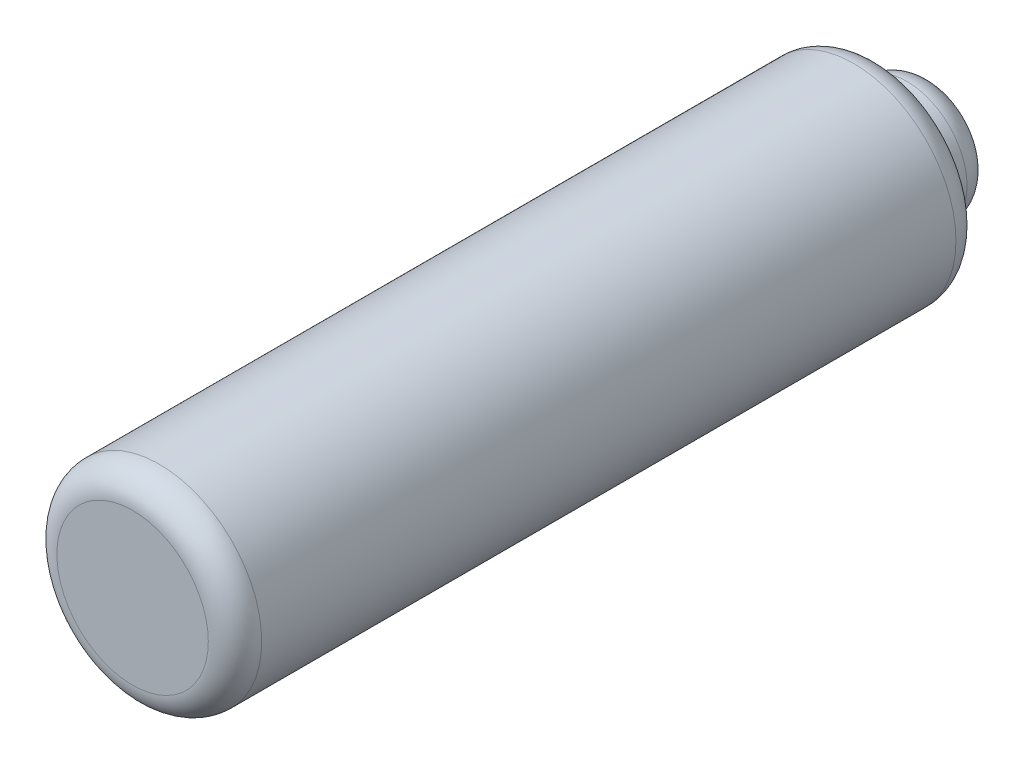
ISO-10303-21;
HEADER;
FILE_DESCRIPTION(('STEP AP214'),'2;1');
FILE_NAME('part.step','',(''),(''),'','','');
FILE_SCHEMA(('AUTOMOTIVE_DESIGN { 1 0 10303 214 1 1 1 1 }'));
ENDSEC;
DATA;
#1=APPLICATION_CONTEXT('core data for automotive mechanical design processes');
#2=APPLICATION_PROTOCOL_DEFINITION('international standard','automotive_design',2000,#1);
#3=PRODUCT_CONTEXT('',#1,'mechanical');
#4=PRODUCT('Part','Part','',(#3));
#5=PRODUCT_RELATED_PRODUCT_CATEGORY('part','',(#4));
#6=PRODUCT_DEFINITION_FORMATION('','',#4);
#7=PRODUCT_DEFINITION_CONTEXT('part definition',#1,'design');
#8=PRODUCT_DEFINITION('design','',#6,#7);
#9=PRODUCT_DEFINITION_SHAPE('','',#8);
#10=(LENGTH_UNIT() NAMED_UNIT(*) SI_UNIT(.MILLI.,.METRE.));
#11=(NAMED_UNIT(*) PLANE_ANGLE_UNIT() SI_UNIT($,.RADIAN.));
#12=(NAMED_UNIT(*) SI_UNIT($,.STERADIAN.) SOLID_ANGLE_UNIT());
#13=UNCERTAINTY_MEASURE_WITH_UNIT(LENGTH_MEASURE(1.E-05),#10,'distance_accuracy_value','');
#14=(GEOMETRIC_REPRESENTATION_CONTEXT(3) GLOBAL_UNCERTAINTY_ASSIGNED_CONTEXT((#13)) GLOBAL_UNIT_ASSIGNED_CONTEXT((#10,
#11,#12)) REPRESENTATION_CONTEXT('',''));
#15=CARTESIAN_POINT('',(0.,0.,0.));
#16=DIRECTION('',(0.,0.,1.));
#17=DIRECTION('',(1.,0.,0.));
#18=AXIS2_PLACEMENT_3D('',#15,#16,#17);
#19=CARTESIAN_POINT('',(0.,0.,14.));
#20=DIRECTION('',(0.,0.,-1.));
#21=DIRECTION('',(-1.,0.,0.));
#22=AXIS2_PLACEMENT_3D('',#19,#20,#21);
#23=CYLINDRICAL_SURFACE('',#22,3.835);
#24=CARTESIAN_POINT('',(0.,0.,13.));
#25=DIRECTION('',(0.,0.,1.));
#26=DIRECTION('',(1.,0.,0.));
#27=AXIS2_PLACEMENT_3D('',#24,#25,#26);
#28=CIRCLE('',#27,3.835);
#29=CARTESIAN_POINT('',(3.835,0.,13.));
#30=VERTEX_POINT('',#29);
#31=EDGE_CURVE('E55',#30,#30,#28,.F.);
#32=ORIENTED_EDGE('',*,*,#31,.T.);
#33=EDGE_LOOP('',(#32));
#34=FACE_BOUND('',#33,.T.);
#35=CARTESIAN_POINT('',(0.,0.,-13.));
#36=DIRECTION('',(0.,0.,1.));
#37=DIRECTION('',(1.,0.,0.));
#38=AXIS2_PLACEMENT_3D('',#35,#36,#37);
#39=CIRCLE('',#38,3.835);
#40=CARTESIAN_POINT('',(3.835,0.,-13.));
#41=VERTEX_POINT('',#40);
#42=EDGE_CURVE('E61',#41,#41,#39,.T.);
#43=ORIENTED_EDGE('',*,*,#42,.T.);
#44=EDGE_LOOP('',(#43));
#45=FACE_BOUND('',#44,.T.);
#46=ADVANCED_FACE('F37',(#34,#45),#23,.T.);
#47=CARTESIAN_POINT('',(0.,0.,14.));
#48=DIRECTION('',(0.,0.,1.));
#49=DIRECTION('',(1.,0.,0.));
#50=AXIS2_PLACEMENT_3D('',#47,#48,#49);
#51=PLANE('',#50);
#52=CARTESIAN_POINT('',(0.,0.,14.));
#53=DIRECTION('',(0.,0.,1.));
#54=DIRECTION('',(1.,0.,0.));
#55=AXIS2_PLACEMENT_3D('',#52,#53,#54);
#56=CIRCLE('',#55,2.835);
#57=CARTESIAN_POINT('',(2.835,0.,14.));
#58=VERTEX_POINT('',#57);
#59=EDGE_CURVE('E65',#58,#58,#56,.T.);
#60=ORIENTED_EDGE('',*,*,#59,.T.);
#61=EDGE_LOOP('',(#60));
#62=FACE_BOUND('',#61,.T.);
#63=ADVANCED_FACE('F78',(#62),#51,.T.);
#64=CARTESIAN_POINT('',(0.,0.,-14.));
#65=DIRECTION('',(0.,0.,1.));
#66=DIRECTION('',(1.,0.,0.));
#67=AXIS2_PLACEMENT_3D('',#64,#65,#66);
#68=PLANE('',#67);
#69=CARTESIAN_POINT('',(0.,0.,-14.));
#70=DIRECTION('',(0.,0.,1.));
#71=DIRECTION('',(1.,0.,0.));
#72=AXIS2_PLACEMENT_3D('',#69,#70,#71);
#73=CIRCLE('',#72,2.835);
#74=CARTESIAN_POINT('',(2.835,0.,-14.));
#75=VERTEX_POINT('',#74);
#76=EDGE_CURVE('E50',#75,#75,#73,.F.);
#77=ORIENTED_EDGE('',*,*,#76,.T.);
#78=EDGE_LOOP('',(#77));
#79=FACE_BOUND('',#78,.T.);
#80=CARTESIAN_POINT('',(0.,0.,-14.));
#81=DIRECTION('',(0.,0.,-1.));
#82=DIRECTION('',(-1.,0.,0.));
#83=AXIS2_PLACEMENT_3D('',#80,#81,#82);
#84=CIRCLE('',#83,2.25);
#85=CARTESIAN_POINT('',(-2.25,0.,-14.));
#86=VERTEX_POINT('',#85);
#87=EDGE_CURVE('E69',#86,#86,#84,.T.);
#88=ORIENTED_EDGE('',*,*,#87,.F.);
#89=EDGE_LOOP('',(#88));
#90=FACE_BOUND('',#89,.T.);
#91=ADVANCED_FACE('F76',(#79,#90),#68,.F.);
#92=CARTESIAN_POINT('',(0.,0.,-16.));
#93=DIRECTION('',(0.,0.,1.));
#94=DIRECTION('',(1.,0.,0.));
#95=AXIS2_PLACEMENT_3D('',#92,#93,#94);
#96=CYLINDRICAL_SURFACE('',#95,2.25);
#97=CARTESIAN_POINT('',(0.,0.,-15.));
#98=DIRECTION('',(0.,0.,-1.));
#99=DIRECTION('',(-1.,0.,0.));
#100=AXIS2_PLACEMENT_3D('',#97,#98,#99);
#101=CIRCLE('',#100,2.25);
#102=CARTESIAN_POINT('',(-2.25,0.,-15.));
#103=VERTEX_POINT('',#102);
#104=EDGE_CURVE('E10',#103,#103,#101,.F.);
#105=ORIENTED_EDGE('',*,*,#104,.T.);
#106=EDGE_LOOP('',(#105));
#107=FACE_BOUND('',#106,.T.);
#108=ORIENTED_EDGE('',*,*,#87,.T.);
#109=EDGE_LOOP('',(#108));
#110=FACE_BOUND('',#109,.T.);
#111=ADVANCED_FACE('F74',(#107,#110),#96,.T.);
#112=CARTESIAN_POINT('',(0.,0.,-16.));
#113=DIRECTION('',(0.,0.,-1.));
#114=DIRECTION('',(-1.,0.,0.));
#115=AXIS2_PLACEMENT_3D('',#112,#113,#114);
#116=PLANE('',#115);
#117=CARTESIAN_POINT('',(0.,0.,-16.));
#118=DIRECTION('',(0.,0.,-1.));
#119=DIRECTION('',(-1.,0.,0.));
#120=AXIS2_PLACEMENT_3D('',#117,#118,#119);
#121=CIRCLE('',#120,1.25);
#122=CARTESIAN_POINT('',(-1.25,0.,-16.));
#123=VERTEX_POINT('',#122);
#124=EDGE_CURVE('E45',#123,#123,#121,.T.);
#125=ORIENTED_EDGE('',*,*,#124,.T.);
#126=EDGE_LOOP('',(#125));
#127=FACE_BOUND('',#126,.T.);
#128=ADVANCED_FACE('F85',(#127),#116,.T.);
#129=CARTESIAN_POINT('',(0.,0.,13.));
#130=DIRECTION('',(0.,0.,1.));
#131=DIRECTION('',(1.,0.,0.));
#132=AXIS2_PLACEMENT_3D('',#129,#130,#131);
#133=TOROIDAL_SURFACE('',#132,2.835,1.);
#134=ORIENTED_EDGE('',*,*,#31,.F.);
#135=EDGE_LOOP('',(#134));
#136=FACE_BOUND('',#135,.T.);
#137=ORIENTED_EDGE('',*,*,#59,.F.);
#138=EDGE_LOOP('',(#137));
#139=FACE_BOUND('',#138,.T.);
#140=ADVANCED_FACE('F96',(#136,#139),#133,.T.);
#141=CARTESIAN_POINT('',(0.,0.,-13.));
#142=DIRECTION('',(0.,0.,1.));
#143=DIRECTION('',(1.,0.,0.));
#144=AXIS2_PLACEMENT_3D('',#141,#142,#143);
#145=TOROIDAL_SURFACE('',#144,2.835,1.);
#146=ORIENTED_EDGE('',*,*,#76,.F.);
#147=EDGE_LOOP('',(#146));
#148=FACE_BOUND('',#147,.T.);
#149=ORIENTED_EDGE('',*,*,#42,.F.);
#150=EDGE_LOOP('',(#149));
#151=FACE_BOUND('',#150,.T.);
#152=ADVANCED_FACE('F98',(#148,#151),#145,.T.);
#153=CARTESIAN_POINT('',(0.,0.,-15.));
#154=DIRECTION('',(0.,0.,-1.));
#155=DIRECTION('',(-1.,0.,0.));
#156=AXIS2_PLACEMENT_3D('',#153,#154,#155);
#157=TOROIDAL_SURFACE('',#156,1.25,1.);
#158=ORIENTED_EDGE('',*,*,#104,.F.);
#159=EDGE_LOOP('',(#158));
#160=FACE_BOUND('',#159,.T.);
#161=ORIENTED_EDGE('',*,*,#124,.F.);
#162=EDGE_LOOP('',(#161));
#163=FACE_BOUND('',#162,.T.);
#164=ADVANCED_FACE('F39',(#160,#163),#157,.T.);
#165=CLOSED_SHELL('',(#46,#63,#91,#111,#128,#140,#152,#164));
#166=MANIFOLD_SOLID_BREP('B2',#165);
#167=ADVANCED_BREP_SHAPE_REPRESENTATION('',(#18,#166),#14);
#168=SHAPE_DEFINITION_REPRESENTATION(#9,#167);
ENDSEC;
END-ISO-10303-21;
